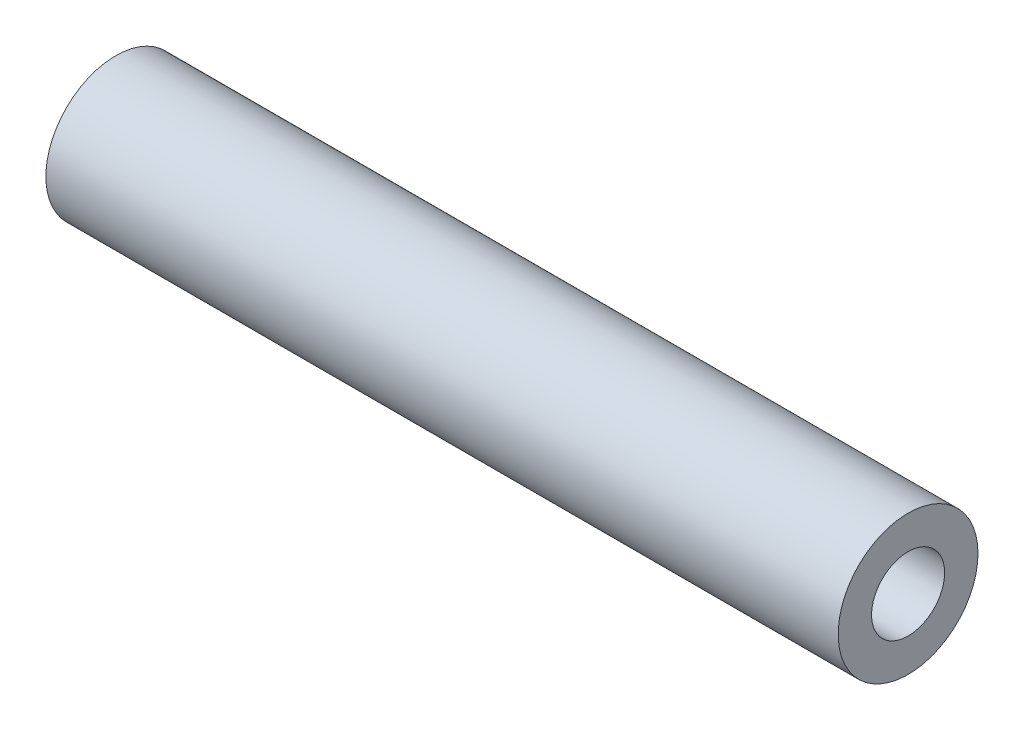
ISO-10303-21;
HEADER;
FILE_DESCRIPTION(('STEP AP214'),'2;1');
FILE_NAME('part.step','',(''),(''),'','','');
FILE_SCHEMA(('AUTOMOTIVE_DESIGN { 1 0 10303 214 1 1 1 1 }'));
ENDSEC;
DATA;
#1=APPLICATION_CONTEXT('core data for automotive mechanical design processes');
#2=APPLICATION_PROTOCOL_DEFINITION('international standard','automotive_design',2000,#1);
#3=PRODUCT_CONTEXT('',#1,'mechanical');
#4=PRODUCT('Part','Part','',(#3));
#5=PRODUCT_RELATED_PRODUCT_CATEGORY('part','',(#4));
#6=PRODUCT_DEFINITION_FORMATION('','',#4);
#7=PRODUCT_DEFINITION_CONTEXT('part definition',#1,'design');
#8=PRODUCT_DEFINITION('design','',#6,#7);
#9=PRODUCT_DEFINITION_SHAPE('','',#8);
#10=(LENGTH_UNIT() NAMED_UNIT(*) SI_UNIT(.MILLI.,.METRE.));
#11=(NAMED_UNIT(*) PLANE_ANGLE_UNIT() SI_UNIT($,.RADIAN.));
#12=(NAMED_UNIT(*) SI_UNIT($,.STERADIAN.) SOLID_ANGLE_UNIT());
#13=UNCERTAINTY_MEASURE_WITH_UNIT(LENGTH_MEASURE(1.E-05),#10,'distance_accuracy_value','');
#14=(GEOMETRIC_REPRESENTATION_CONTEXT(3) GLOBAL_UNCERTAINTY_ASSIGNED_CONTEXT((#13)) GLOBAL_UNIT_ASSIGNED_CONTEXT((#10,
#11,#12)) REPRESENTATION_CONTEXT('',''));
#15=CARTESIAN_POINT('',(0.,0.,0.));
#16=DIRECTION('',(0.,0.,1.));
#17=DIRECTION('',(1.,0.,0.));
#18=AXIS2_PLACEMENT_3D('',#15,#16,#17);
#19=CARTESIAN_POINT('',(-103.957884181604,0.,0.));
#20=DIRECTION('',(1.,0.,0.));
#21=DIRECTION('',(0.,0.,1.));
#22=AXIS2_PLACEMENT_3D('',#19,#20,#21);
#23=CYLINDRICAL_SURFACE('',#22,4.76250000000001);
#24=CARTESIAN_POINT('',(-36.5125,0.,0.));
#25=DIRECTION('',(1.,0.,0.));
#26=DIRECTION('',(0.,0.,-1.));
#27=AXIS2_PLACEMENT_3D('',#24,#25,#26);
#28=CIRCLE('',#27,4.76250000000001);
#29=CARTESIAN_POINT('',(-36.5125,0.,-4.76250000000001));
#30=VERTEX_POINT('',#29);
#31=EDGE_CURVE('E50',#30,#30,#28,.T.);
#32=ORIENTED_EDGE('',*,*,#31,.F.);
#33=EDGE_LOOP('',(#32));
#34=FACE_BOUND('',#33,.T.);
#35=CARTESIAN_POINT('',(-90.4875,0.,0.));
#36=DIRECTION('',(1.,0.,0.));
#37=DIRECTION('',(0.,0.,-1.));
#38=AXIS2_PLACEMENT_3D('',#35,#36,#37);
#39=CIRCLE('',#38,4.76250000000001);
#40=CARTESIAN_POINT('',(-90.4875,0.,-4.76250000000001));
#41=VERTEX_POINT('',#40);
#42=EDGE_CURVE('E41',#41,#41,#39,.T.);
#43=ORIENTED_EDGE('',*,*,#42,.T.);
#44=EDGE_LOOP('',(#43));
#45=FACE_BOUND('',#44,.T.);
#46=ADVANCED_FACE('F37',(#34,#45),#23,.T.);
#47=CARTESIAN_POINT('',(-36.5125,0.,0.));
#48=DIRECTION('',(-1.,0.,0.));
#49=DIRECTION('',(0.,0.,-1.));
#50=AXIS2_PLACEMENT_3D('',#47,#48,#49);
#51=PLANE('',#50);
#52=ORIENTED_EDGE('',*,*,#31,.T.);
#53=EDGE_LOOP('',(#52));
#54=FACE_BOUND('',#53,.T.);
#55=CARTESIAN_POINT('',(-36.5125,0.,0.));
#56=DIRECTION('',(1.,0.,0.));
#57=DIRECTION('',(0.,0.,-1.));
#58=AXIS2_PLACEMENT_3D('',#55,#56,#57);
#59=CIRCLE('',#58,2.4892);
#60=CARTESIAN_POINT('',(-36.5125,0.,-2.4892));
#61=VERTEX_POINT('',#60);
#62=EDGE_CURVE('E45',#61,#61,#59,.T.);
#63=ORIENTED_EDGE('',*,*,#62,.F.);
#64=EDGE_LOOP('',(#63));
#65=FACE_BOUND('',#64,.T.);
#66=ADVANCED_FACE('F64',(#54,#65),#51,.F.);
#67=CARTESIAN_POINT('',(-103.957884181604,0.,0.));
#68=DIRECTION('',(1.,0.,0.));
#69=DIRECTION('',(0.,0.,1.));
#70=AXIS2_PLACEMENT_3D('',#67,#68,#69);
#71=CYLINDRICAL_SURFACE('',#70,2.4892);
#72=ORIENTED_EDGE('',*,*,#62,.T.);
#73=EDGE_LOOP('',(#72));
#74=FACE_BOUND('',#73,.T.);
#75=CARTESIAN_POINT('',(-90.4875,0.,0.));
#76=DIRECTION('',(1.,0.,0.));
#77=DIRECTION('',(0.,0.,-1.));
#78=AXIS2_PLACEMENT_3D('',#75,#76,#77);
#79=CIRCLE('',#78,2.4892);
#80=CARTESIAN_POINT('',(-90.4875,0.,-2.4892));
#81=VERTEX_POINT('',#80);
#82=EDGE_CURVE('E10',#81,#81,#79,.T.);
#83=ORIENTED_EDGE('',*,*,#82,.F.);
#84=EDGE_LOOP('',(#83));
#85=FACE_BOUND('',#84,.T.);
#86=ADVANCED_FACE('F60',(#74,#85),#71,.F.);
#87=CARTESIAN_POINT('',(-90.4875,-25.4,160.02));
#88=DIRECTION('',(-1.,0.,0.));
#89=DIRECTION('',(0.,0.,1.));
#90=AXIS2_PLACEMENT_3D('',#87,#88,#89);
#91=PLANE('',#90);
#92=ORIENTED_EDGE('',*,*,#82,.T.);
#93=EDGE_LOOP('',(#92));
#94=FACE_BOUND('',#93,.T.);
#95=ORIENTED_EDGE('',*,*,#42,.F.);
#96=EDGE_LOOP('',(#95));
#97=FACE_BOUND('',#96,.T.);
#98=ADVANCED_FACE('F39',(#94,#97),#91,.T.);
#99=CLOSED_SHELL('',(#46,#66,#86,#98));
#100=MANIFOLD_SOLID_BREP('B2',#99);
#101=ADVANCED_BREP_SHAPE_REPRESENTATION('',(#18,#100),#14);
#102=SHAPE_DEFINITION_REPRESENTATION(#9,#101);
ENDSEC;
END-ISO-10303-21;
